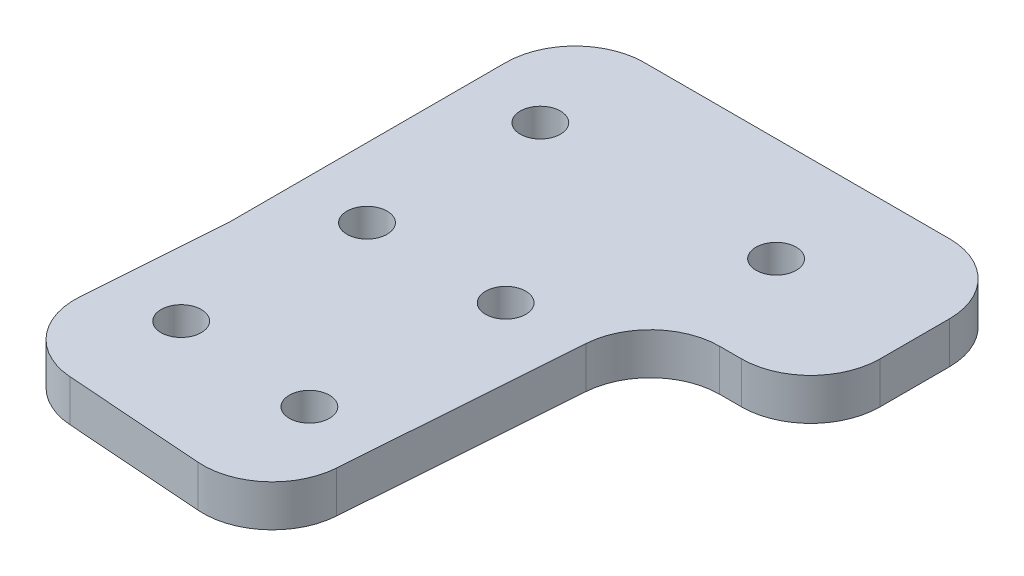
ISO-10303-21;
HEADER;
FILE_DESCRIPTION(('STEP AP214'),'2;1');
FILE_NAME('part.step','',(''),(''),'','','');
FILE_SCHEMA(('AUTOMOTIVE_DESIGN { 1 0 10303 214 1 1 1 1 }'));
ENDSEC;
DATA;
#1=APPLICATION_CONTEXT('core data for automotive mechanical design processes');
#2=APPLICATION_PROTOCOL_DEFINITION('international standard','automotive_design',2000,#1);
#3=PRODUCT_CONTEXT('',#1,'mechanical');
#4=PRODUCT('Part','Part','',(#3));
#5=PRODUCT_RELATED_PRODUCT_CATEGORY('part','',(#4));
#6=PRODUCT_DEFINITION_FORMATION('','',#4);
#7=PRODUCT_DEFINITION_CONTEXT('part definition',#1,'design');
#8=PRODUCT_DEFINITION('design','',#6,#7);
#9=PRODUCT_DEFINITION_SHAPE('','',#8);
#10=(LENGTH_UNIT() NAMED_UNIT(*) SI_UNIT(.MILLI.,.METRE.));
#11=(NAMED_UNIT(*) PLANE_ANGLE_UNIT() SI_UNIT($,.RADIAN.));
#12=(NAMED_UNIT(*) SI_UNIT($,.STERADIAN.) SOLID_ANGLE_UNIT());
#13=UNCERTAINTY_MEASURE_WITH_UNIT(LENGTH_MEASURE(1.E-05),#10,'distance_accuracy_value','');
#14=(GEOMETRIC_REPRESENTATION_CONTEXT(3) GLOBAL_UNCERTAINTY_ASSIGNED_CONTEXT((#13)) GLOBAL_UNIT_ASSIGNED_CONTEXT((#10,
#11,#12)) REPRESENTATION_CONTEXT('',''));
#15=CARTESIAN_POINT('',(0.,0.,0.));
#16=DIRECTION('',(0.,0.,1.));
#17=DIRECTION('',(1.,0.,0.));
#18=AXIS2_PLACEMENT_3D('',#15,#16,#17);
#19=CARTESIAN_POINT('',(0.,3.,0.));
#20=DIRECTION('',(0.,-1.,0.));
#21=DIRECTION('',(0.,0.,-1.));
#22=AXIS2_PLACEMENT_3D('',#19,#20,#21);
#23=PLANE('',#22);
#24=DIRECTION('',(0.,0.,-1.));
#25=VECTOR('',#24,1.);
#26=CARTESIAN_POINT('',(32.,3.,-15.));
#27=LINE('',#26,#25);
#28=CARTESIAN_POINT('',(32.,3.,-5.));
#29=VERTEX_POINT('',#28);
#30=CARTESIAN_POINT('',(32.,3.,-10.));
#31=VERTEX_POINT('',#30);
#32=EDGE_CURVE('E259',#29,#31,#27,.T.);
#33=ORIENTED_EDGE('',*,*,#32,.T.);
#34=CARTESIAN_POINT('',(27.,3.,-10.));
#35=DIRECTION('',(0.,-1.,0.));
#36=DIRECTION('',(0.,0.,-1.));
#37=AXIS2_PLACEMENT_3D('',#34,#35,#36);
#38=CIRCLE('',#37,5.);
#39=CARTESIAN_POINT('',(27.,3.,-15.));
#40=VERTEX_POINT('',#39);
#41=EDGE_CURVE('E198',#31,#40,#38,.F.);
#42=ORIENTED_EDGE('',*,*,#41,.T.);
#43=DIRECTION('',(-1.,0.,0.));
#44=VECTOR('',#43,1.);
#45=CARTESIAN_POINT('',(20.7810293969132,3.,-15.));
#46=LINE('',#45,#44);
#47=CARTESIAN_POINT('',(5.,3.,-15.));
#48=VERTEX_POINT('',#47);
#49=EDGE_CURVE('E163',#40,#48,#46,.T.);
#50=ORIENTED_EDGE('',*,*,#49,.T.);
#51=CARTESIAN_POINT('',(5.,3.,-10.));
#52=DIRECTION('',(0.,-1.,0.));
#53=DIRECTION('',(0.,0.,-1.));
#54=AXIS2_PLACEMENT_3D('',#51,#52,#53);
#55=CIRCLE('',#54,5.);
#56=CARTESIAN_POINT('',(0.,3.,-10.));
#57=VERTEX_POINT('',#56);
#58=EDGE_CURVE('E194',#48,#57,#55,.F.);
#59=ORIENTED_EDGE('',*,*,#58,.T.);
#60=DIRECTION('',(0.,0.,1.));
#61=VECTOR('',#60,1.);
#62=CARTESIAN_POINT('',(0.,3.,0.));
#63=LINE('',#62,#61);
#64=CARTESIAN_POINT('',(0.,3.,9.81821853800079));
#65=VERTEX_POINT('',#64);
#66=EDGE_CURVE('E171',#57,#65,#63,.T.);
#67=ORIENTED_EDGE('',*,*,#66,.T.);
#68=CARTESIAN_POINT('',(-5.,3.,9.81821853800079));
#69=DIRECTION('',(0.,-1.,0.));
#70=DIRECTION('',(0.,0.,-1.));
#71=AXIS2_PLACEMENT_3D('',#68,#69,#70);
#72=CIRCLE('',#71,5.);
#73=CARTESIAN_POINT('',(-0.0132003520093877,3.,10.1813015461418));
#74=VERTEX_POINT('',#73);
#75=EDGE_CURVE('E11',#65,#74,#72,.T.);
#76=ORIENTED_EDGE('',*,*,#75,.T.);
#77=DIRECTION('',(-0.0726166016281965,0.,0.997359929598122));
#78=VECTOR('',#77,1.);
#79=CARTESIAN_POINT('',(-1.089249024423,3.,24.9603989439725));
#80=LINE('',#79,#78);
#81=CARTESIAN_POINT('',(-0.726166016282043,3.,19.9735992959823));
#82=VERTEX_POINT('',#81);
#83=EDGE_CURVE('E175',#74,#82,#80,.T.);
#84=ORIENTED_EDGE('',*,*,#83,.T.);
#85=CARTESIAN_POINT('',(4.26063363170857,3.,20.3366823041233));
#86=DIRECTION('',(0.,-1.,0.));
#87=DIRECTION('',(0.,0.,-1.));
#88=AXIS2_PLACEMENT_3D('',#85,#86,#87);
#89=CIRCLE('',#88,5.);
#90=CARTESIAN_POINT('',(3.89755062356721,3.,25.3234819521139));
#91=VERTEX_POINT('',#90);
#92=EDGE_CURVE('E190',#82,#91,#89,.F.);
#93=ORIENTED_EDGE('',*,*,#92,.T.);
#94=DIRECTION('',(0.997359929598117,0.,0.0726166016282721));
#95=VECTOR('',#94,1.);
#96=CARTESIAN_POINT('',(18.8579495675394,3.,26.412730976538));
#97=LINE('',#96,#95);
#98=CARTESIAN_POINT('',(13.8711499195484,3.,26.0496479683966));
#99=VERTEX_POINT('',#98);
#100=EDGE_CURVE('E249',#91,#99,#97,.T.);
#101=ORIENTED_EDGE('',*,*,#100,.T.);
#102=CARTESIAN_POINT('',(14.2342329276898,3.,21.062848320406));
#103=DIRECTION('',(0.,-1.,0.));
#104=DIRECTION('',(0.,0.,-1.));
#105=AXIS2_PLACEMENT_3D('',#102,#103,#104);
#106=CIRCLE('',#105,5.);
#107=CARTESIAN_POINT('',(19.2210325756804,3.,21.425931328547));
#108=VERTEX_POINT('',#107);
#109=EDGE_CURVE('E192',#99,#108,#106,.F.);
#110=ORIENTED_EDGE('',*,*,#109,.T.);
#111=DIRECTION('',(0.0726166016281945,0.,-0.997359929598123));
#112=VECTOR('',#111,1.);
#113=CARTESIAN_POINT('',(19.9471985919625,3.,11.4523320325638));
#114=LINE('',#113,#112);
#115=CARTESIAN_POINT('',(20.443420932819,3.,4.63691699185902));
#116=VERTEX_POINT('',#115);
#117=EDGE_CURVE('E252',#108,#116,#114,.T.);
#118=ORIENTED_EDGE('',*,*,#117,.T.);
#119=CARTESIAN_POINT('',(25.4302205808096,3.,5.));
#120=DIRECTION('',(0.,-1.,0.));
#121=DIRECTION('',(0.,0.,-1.));
#122=AXIS2_PLACEMENT_3D('',#119,#120,#121);
#123=CIRCLE('',#122,5.);
#124=CARTESIAN_POINT('',(25.4302205808096,3.,0.));
#125=VERTEX_POINT('',#124);
#126=EDGE_CURVE('E63',#116,#125,#123,.T.);
#127=ORIENTED_EDGE('',*,*,#126,.T.);
#128=DIRECTION('',(1.,0.,0.));
#129=VECTOR('',#128,1.);
#130=CARTESIAN_POINT('',(32.,3.,0.));
#131=LINE('',#130,#129);
#132=CARTESIAN_POINT('',(27.,3.,0.));
#133=VERTEX_POINT('',#132);
#134=EDGE_CURVE('E257',#125,#133,#131,.T.);
#135=ORIENTED_EDGE('',*,*,#134,.T.);
#136=CARTESIAN_POINT('',(27.,3.,-5.));
#137=DIRECTION('',(0.,-1.,0.));
#138=DIRECTION('',(0.,0.,-1.));
#139=AXIS2_PLACEMENT_3D('',#136,#137,#138);
#140=CIRCLE('',#139,5.);
#141=EDGE_CURVE('E196',#133,#29,#140,.F.);
#142=ORIENTED_EDGE('',*,*,#141,.T.);
#143=EDGE_LOOP('',(#33,#42,#50,#59,#67,#76,#84,#93,#101,#110,#118,#127,#135,#142));
#144=FACE_BOUND('',#143,.T.);
#145=CARTESIAN_POINT('',(5.,3.,-7.5));
#146=DIRECTION('',(0.,1.,0.));
#147=DIRECTION('',(0.,0.,1.));
#148=AXIS2_PLACEMENT_3D('',#145,#146,#147);
#149=CIRCLE('',#148,1.45);
#150=CARTESIAN_POINT('',(5.,3.,-6.05));
#151=VERTEX_POINT('',#150);
#152=EDGE_CURVE('E238',#151,#151,#149,.T.);
#153=ORIENTED_EDGE('',*,*,#152,.F.);
#154=EDGE_LOOP('',(#153));
#155=FACE_BOUND('',#154,.T.);
#156=CARTESIAN_POINT('',(22.,3.,-7.5));
#157=DIRECTION('',(0.,1.,0.));
#158=DIRECTION('',(0.,0.,1.));
#159=AXIS2_PLACEMENT_3D('',#156,#157,#158);
#160=CIRCLE('',#159,1.45);
#161=CARTESIAN_POINT('',(22.,3.,-6.05));
#162=VERTEX_POINT('',#161);
#163=EDGE_CURVE('E352',#162,#162,#160,.T.);
#164=ORIENTED_EDGE('',*,*,#163,.F.);
#165=EDGE_LOOP('',(#164));
#166=FACE_BOUND('',#165,.T.);
#167=CARTESIAN_POINT('',(4.44217513577913,3.,17.8432824801269));
#168=DIRECTION('',(0.,1.,0.));
#169=DIRECTION('',(0.,0.,1.));
#170=AXIS2_PLACEMENT_3D('',#167,#168,#169);
#171=CIRCLE('',#170,1.45000000000004);
#172=CARTESIAN_POINT('',(4.44217513577913,3.,19.2932824801269));
#173=VERTEX_POINT('',#172);
#174=EDGE_CURVE('E346',#173,#173,#171,.T.);
#175=ORIENTED_EDGE('',*,*,#174,.F.);
#176=EDGE_LOOP('',(#175));
#177=FACE_BOUND('',#176,.T.);
#178=CARTESIAN_POINT('',(14.4157744317604,3.,18.5694484964088));
#179=DIRECTION('',(0.,1.,0.));
#180=DIRECTION('',(0.,0.,1.));
#181=AXIS2_PLACEMENT_3D('',#178,#179,#180);
#182=CIRCLE('',#181,1.45000000000003);
#183=CARTESIAN_POINT('',(14.4157744317604,3.,20.0194484964089));
#184=VERTEX_POINT('',#183);
#185=EDGE_CURVE('E340',#184,#184,#182,.T.);
#186=ORIENTED_EDGE('',*,*,#185,.F.);
#187=EDGE_LOOP('',(#186));
#188=FACE_BOUND('',#187,.T.);
#189=CARTESIAN_POINT('',(5.,3.,5.));
#190=DIRECTION('',(0.,1.,0.));
#191=DIRECTION('',(0.,0.,1.));
#192=AXIS2_PLACEMENT_3D('',#189,#190,#191);
#193=CIRCLE('',#192,1.45);
#194=CARTESIAN_POINT('',(5.,3.,6.45));
#195=VERTEX_POINT('',#194);
#196=EDGE_CURVE('E334',#195,#195,#193,.T.);
#197=ORIENTED_EDGE('',*,*,#196,.F.);
#198=EDGE_LOOP('',(#197));
#199=FACE_BOUND('',#198,.T.);
#200=CARTESIAN_POINT('',(15.,3.,5.));
#201=DIRECTION('',(0.,1.,0.));
#202=DIRECTION('',(0.,0.,1.));
#203=AXIS2_PLACEMENT_3D('',#200,#201,#202);
#204=CIRCLE('',#203,1.45);
#205=CARTESIAN_POINT('',(15.,3.,6.45));
#206=VERTEX_POINT('',#205);
#207=EDGE_CURVE('E325',#206,#206,#204,.T.);
#208=ORIENTED_EDGE('',*,*,#207,.F.);
#209=EDGE_LOOP('',(#208));
#210=FACE_BOUND('',#209,.T.);
#211=ADVANCED_FACE('F41',(#144,#155,#166,#177,#188,#199,#210),#23,.F.);
#212=CARTESIAN_POINT('',(0.,0.,0.));
#213=DIRECTION('',(0.,-1.,0.));
#214=DIRECTION('',(0.,0.,-1.));
#215=AXIS2_PLACEMENT_3D('',#212,#213,#214);
#216=PLANE('',#215);
#217=CARTESIAN_POINT('',(5.,0.,5.));
#218=DIRECTION('',(0.,1.,0.));
#219=DIRECTION('',(0.,0.,1.));
#220=AXIS2_PLACEMENT_3D('',#217,#218,#219);
#221=CIRCLE('',#220,1.45);
#222=CARTESIAN_POINT('',(5.,0.,6.45));
#223=VERTEX_POINT('',#222);
#224=EDGE_CURVE('E331',#223,#223,#221,.T.);
#225=ORIENTED_EDGE('',*,*,#224,.T.);
#226=EDGE_LOOP('',(#225));
#227=FACE_BOUND('',#226,.T.);
#228=CARTESIAN_POINT('',(4.44217513577913,0.,17.8432824801269));
#229=DIRECTION('',(0.,1.,0.));
#230=DIRECTION('',(0.,0.,1.));
#231=AXIS2_PLACEMENT_3D('',#228,#229,#230);
#232=CIRCLE('',#231,1.45000000000004);
#233=CARTESIAN_POINT('',(4.44217513577913,0.,19.2932824801269));
#234=VERTEX_POINT('',#233);
#235=EDGE_CURVE('E343',#234,#234,#232,.T.);
#236=ORIENTED_EDGE('',*,*,#235,.T.);
#237=EDGE_LOOP('',(#236));
#238=FACE_BOUND('',#237,.T.);
#239=CARTESIAN_POINT('',(5.,0.,-7.5));
#240=DIRECTION('',(0.,1.,0.));
#241=DIRECTION('',(0.,0.,1.));
#242=AXIS2_PLACEMENT_3D('',#239,#240,#241);
#243=CIRCLE('',#242,1.45);
#244=CARTESIAN_POINT('',(5.,0.,-6.05));
#245=VERTEX_POINT('',#244);
#246=EDGE_CURVE('E355',#245,#245,#243,.T.);
#247=ORIENTED_EDGE('',*,*,#246,.T.);
#248=EDGE_LOOP('',(#247));
#249=FACE_BOUND('',#248,.T.);
#250=DIRECTION('',(-1.,0.,0.));
#251=VECTOR('',#250,1.);
#252=CARTESIAN_POINT('',(0.,0.,-15.));
#253=LINE('',#252,#251);
#254=CARTESIAN_POINT('',(27.,0.,-15.));
#255=VERTEX_POINT('',#254);
#256=CARTESIAN_POINT('',(5.,0.,-15.));
#257=VERTEX_POINT('',#256);
#258=EDGE_CURVE('E160',#255,#257,#253,.T.);
#259=ORIENTED_EDGE('',*,*,#258,.F.);
#260=CARTESIAN_POINT('',(27.,0.,-10.));
#261=DIRECTION('',(0.,-1.,0.));
#262=DIRECTION('',(0.,0.,-1.));
#263=AXIS2_PLACEMENT_3D('',#260,#261,#262);
#264=CIRCLE('',#263,5.);
#265=CARTESIAN_POINT('',(32.,0.,-10.));
#266=VERTEX_POINT('',#265);
#267=EDGE_CURVE('E143',#255,#266,#264,.T.);
#268=ORIENTED_EDGE('',*,*,#267,.T.);
#269=DIRECTION('',(0.,0.,-1.));
#270=VECTOR('',#269,1.);
#271=CARTESIAN_POINT('',(32.,0.,-15.));
#272=LINE('',#271,#270);
#273=CARTESIAN_POINT('',(32.,0.,-5.));
#274=VERTEX_POINT('',#273);
#275=EDGE_CURVE('E172',#274,#266,#272,.T.);
#276=ORIENTED_EDGE('',*,*,#275,.F.);
#277=CARTESIAN_POINT('',(27.,0.,-5.));
#278=DIRECTION('',(0.,-1.,0.));
#279=DIRECTION('',(0.,0.,-1.));
#280=AXIS2_PLACEMENT_3D('',#277,#278,#279);
#281=CIRCLE('',#280,5.);
#282=CARTESIAN_POINT('',(27.,0.,0.));
#283=VERTEX_POINT('',#282);
#284=EDGE_CURVE('E154',#274,#283,#281,.T.);
#285=ORIENTED_EDGE('',*,*,#284,.T.);
#286=DIRECTION('',(1.,0.,0.));
#287=VECTOR('',#286,1.);
#288=CARTESIAN_POINT('',(32.,0.,0.));
#289=LINE('',#288,#287);
#290=CARTESIAN_POINT('',(25.4302205808096,0.,0.));
#291=VERTEX_POINT('',#290);
#292=EDGE_CURVE('E177',#291,#283,#289,.T.);
#293=ORIENTED_EDGE('',*,*,#292,.F.);
#294=CARTESIAN_POINT('',(25.4302205808096,0.,5.));
#295=DIRECTION('',(0.,-1.,0.));
#296=DIRECTION('',(0.,0.,-1.));
#297=AXIS2_PLACEMENT_3D('',#294,#295,#296);
#298=CIRCLE('',#297,5.);
#299=CARTESIAN_POINT('',(20.443420932819,0.,4.63691699185902));
#300=VERTEX_POINT('',#299);
#301=EDGE_CURVE('E224',#291,#300,#298,.F.);
#302=ORIENTED_EDGE('',*,*,#301,.T.);
#303=DIRECTION('',(0.0726166016281951,0.,-0.997359929598123));
#304=VECTOR('',#303,1.);
#305=CARTESIAN_POINT('',(19.9471985919625,0.,11.4523320325638));
#306=LINE('',#305,#304);
#307=CARTESIAN_POINT('',(19.2210325756804,0.,21.425931328547));
#308=VERTEX_POINT('',#307);
#309=EDGE_CURVE('E266',#308,#300,#306,.T.);
#310=ORIENTED_EDGE('',*,*,#309,.F.);
#311=CARTESIAN_POINT('',(14.2342329276898,0.,21.062848320406));
#312=DIRECTION('',(0.,-1.,0.));
#313=DIRECTION('',(0.,0.,-1.));
#314=AXIS2_PLACEMENT_3D('',#311,#312,#313);
#315=CIRCLE('',#314,5.);
#316=CARTESIAN_POINT('',(13.8711499195484,0.,26.0496479683966));
#317=VERTEX_POINT('',#316);
#318=EDGE_CURVE('E183',#308,#317,#315,.T.);
#319=ORIENTED_EDGE('',*,*,#318,.T.);
#320=DIRECTION('',(0.997359929598117,0.,0.0726166016282721));
#321=VECTOR('',#320,1.);
#322=CARTESIAN_POINT('',(18.8579495675394,0.,26.412730976538));
#323=LINE('',#322,#321);
#324=CARTESIAN_POINT('',(3.89755062356721,0.,25.3234819521139));
#325=VERTEX_POINT('',#324);
#326=EDGE_CURVE('E263',#325,#317,#323,.T.);
#327=ORIENTED_EDGE('',*,*,#326,.F.);
#328=CARTESIAN_POINT('',(4.26063363170857,0.,20.3366823041233));
#329=DIRECTION('',(0.,-1.,0.));
#330=DIRECTION('',(0.,0.,-1.));
#331=AXIS2_PLACEMENT_3D('',#328,#329,#330);
#332=CIRCLE('',#331,5.);
#333=CARTESIAN_POINT('',(-0.726166016282043,0.,19.9735992959823));
#334=VERTEX_POINT('',#333);
#335=EDGE_CURVE('E164',#325,#334,#332,.T.);
#336=ORIENTED_EDGE('',*,*,#335,.T.);
#337=DIRECTION('',(-0.0726166016281965,0.,0.997359929598122));
#338=VECTOR('',#337,1.);
#339=CARTESIAN_POINT('',(-1.089249024423,0.,24.9603989439725));
#340=LINE('',#339,#338);
#341=CARTESIAN_POINT('',(-0.0132003520093877,0.,10.1813015461418));
#342=VERTEX_POINT('',#341);
#343=EDGE_CURVE('E230',#342,#334,#340,.T.);
#344=ORIENTED_EDGE('',*,*,#343,.F.);
#345=CARTESIAN_POINT('',(-5.,0.,9.81821853800079));
#346=DIRECTION('',(0.,-1.,0.));
#347=DIRECTION('',(0.,0.,-1.));
#348=AXIS2_PLACEMENT_3D('',#345,#346,#347);
#349=CIRCLE('',#348,5.);
#350=CARTESIAN_POINT('',(0.,0.,9.81821853800079));
#351=VERTEX_POINT('',#350);
#352=EDGE_CURVE('E49',#342,#351,#349,.F.);
#353=ORIENTED_EDGE('',*,*,#352,.T.);
#354=DIRECTION('',(0.,0.,1.));
#355=VECTOR('',#354,1.);
#356=CARTESIAN_POINT('',(0.,0.,0.));
#357=LINE('',#356,#355);
#358=CARTESIAN_POINT('',(0.,0.,-10.));
#359=VERTEX_POINT('',#358);
#360=EDGE_CURVE('E228',#359,#351,#357,.T.);
#361=ORIENTED_EDGE('',*,*,#360,.F.);
#362=CARTESIAN_POINT('',(5.,0.,-10.));
#363=DIRECTION('',(0.,-1.,0.));
#364=DIRECTION('',(0.,0.,-1.));
#365=AXIS2_PLACEMENT_3D('',#362,#363,#364);
#366=CIRCLE('',#365,5.);
#367=EDGE_CURVE('E170',#359,#257,#366,.T.);
#368=ORIENTED_EDGE('',*,*,#367,.T.);
#369=EDGE_LOOP('',(#259,#268,#276,#285,#293,#302,#310,#319,#327,#336,#344,#353,#361,#368));
#370=FACE_BOUND('',#369,.T.);
#371=CARTESIAN_POINT('',(22.,0.,-7.5));
#372=DIRECTION('',(0.,1.,0.));
#373=DIRECTION('',(0.,0.,1.));
#374=AXIS2_PLACEMENT_3D('',#371,#372,#373);
#375=CIRCLE('',#374,1.45);
#376=CARTESIAN_POINT('',(22.,0.,-6.05));
#377=VERTEX_POINT('',#376);
#378=EDGE_CURVE('E349',#377,#377,#375,.T.);
#379=ORIENTED_EDGE('',*,*,#378,.T.);
#380=EDGE_LOOP('',(#379));
#381=FACE_BOUND('',#380,.T.);
#382=CARTESIAN_POINT('',(14.4157744317604,0.,18.5694484964088));
#383=DIRECTION('',(0.,1.,0.));
#384=DIRECTION('',(0.,0.,1.));
#385=AXIS2_PLACEMENT_3D('',#382,#383,#384);
#386=CIRCLE('',#385,1.45000000000003);
#387=CARTESIAN_POINT('',(14.4157744317604,0.,20.0194484964089));
#388=VERTEX_POINT('',#387);
#389=EDGE_CURVE('E337',#388,#388,#386,.T.);
#390=ORIENTED_EDGE('',*,*,#389,.T.);
#391=EDGE_LOOP('',(#390));
#392=FACE_BOUND('',#391,.T.);
#393=CARTESIAN_POINT('',(15.,0.,5.));
#394=DIRECTION('',(0.,1.,0.));
#395=DIRECTION('',(0.,0.,1.));
#396=AXIS2_PLACEMENT_3D('',#393,#394,#395);
#397=CIRCLE('',#396,1.45);
#398=CARTESIAN_POINT('',(15.,0.,6.45));
#399=VERTEX_POINT('',#398);
#400=EDGE_CURVE('E328',#399,#399,#397,.T.);
#401=ORIENTED_EDGE('',*,*,#400,.T.);
#402=EDGE_LOOP('',(#401));
#403=FACE_BOUND('',#402,.T.);
#404=ADVANCED_FACE('F167',(#227,#238,#249,#370,#381,#392,#403),#216,.T.);
#405=CARTESIAN_POINT('',(0.,3.,0.));
#406=DIRECTION('',(1.,0.,0.));
#407=DIRECTION('',(0.,0.,-1.));
#408=AXIS2_PLACEMENT_3D('',#405,#406,#407);
#409=PLANE('',#408);
#410=ORIENTED_EDGE('',*,*,#66,.F.);
#411=DIRECTION('',(0.,-1.,0.));
#412=VECTOR('',#411,1.);
#413=CARTESIAN_POINT('',(0.,3.,-10.));
#414=LINE('',#413,#412);
#415=EDGE_CURVE('E211',#57,#359,#414,.T.);
#416=ORIENTED_EDGE('',*,*,#415,.T.);
#417=ORIENTED_EDGE('',*,*,#360,.T.);
#418=DIRECTION('',(0.,-1.,0.));
#419=VECTOR('',#418,1.);
#420=CARTESIAN_POINT('',(0.,3.,9.81821853800079));
#421=LINE('',#420,#419);
#422=EDGE_CURVE('E209',#351,#65,#421,.F.);
#423=ORIENTED_EDGE('',*,*,#422,.T.);
#424=EDGE_LOOP('',(#410,#416,#417,#423));
#425=FACE_BOUND('',#424,.T.);
#426=ADVANCED_FACE('F236',(#425),#409,.F.);
#427=CARTESIAN_POINT('',(-1.089249024423,3.,24.9603989439725));
#428=DIRECTION('',(0.997359929598122,0.,0.0726166016281965));
#429=DIRECTION('',(0.0726166016281965,0.,-0.997359929598122));
#430=AXIS2_PLACEMENT_3D('',#427,#428,#429);
#431=PLANE('',#430);
#432=ORIENTED_EDGE('',*,*,#343,.T.);
#433=DIRECTION('',(0.,-1.,0.));
#434=VECTOR('',#433,1.);
#435=CARTESIAN_POINT('',(-0.726166016282043,3.,19.9735992959823));
#436=LINE('',#435,#434);
#437=EDGE_CURVE('E222',#334,#82,#436,.F.);
#438=ORIENTED_EDGE('',*,*,#437,.T.);
#439=ORIENTED_EDGE('',*,*,#83,.F.);
#440=DIRECTION('',(0.,-1.,0.));
#441=VECTOR('',#440,1.);
#442=CARTESIAN_POINT('',(-0.0132003520093877,0.,10.1813015461418));
#443=LINE('',#442,#441);
#444=EDGE_CURVE('E219',#74,#342,#443,.T.);
#445=ORIENTED_EDGE('',*,*,#444,.T.);
#446=EDGE_LOOP('',(#432,#438,#439,#445));
#447=FACE_BOUND('',#446,.T.);
#448=ADVANCED_FACE('F247',(#447),#431,.F.);
#449=CARTESIAN_POINT('',(18.8579495675394,3.,26.412730976538));
#450=DIRECTION('',(0.0726166016282721,0.,-0.997359929598117));
#451=DIRECTION('',(-0.997359929598117,0.,-0.0726166016282721));
#452=AXIS2_PLACEMENT_3D('',#449,#450,#451);
#453=PLANE('',#452);
#454=ORIENTED_EDGE('',*,*,#326,.T.);
#455=DIRECTION('',(0.,-1.,0.));
#456=VECTOR('',#455,1.);
#457=CARTESIAN_POINT('',(13.8711499195484,3.,26.0496479683966));
#458=LINE('',#457,#456);
#459=EDGE_CURVE('E217',#317,#99,#458,.F.);
#460=ORIENTED_EDGE('',*,*,#459,.T.);
#461=ORIENTED_EDGE('',*,*,#100,.F.);
#462=DIRECTION('',(0.,-1.,0.));
#463=VECTOR('',#462,1.);
#464=CARTESIAN_POINT('',(3.89755062356721,3.,25.3234819521139));
#465=LINE('',#464,#463);
#466=EDGE_CURVE('E214',#91,#325,#465,.T.);
#467=ORIENTED_EDGE('',*,*,#466,.T.);
#468=EDGE_LOOP('',(#454,#460,#461,#467));
#469=FACE_BOUND('',#468,.T.);
#470=ADVANCED_FACE('F411',(#469),#453,.F.);
#471=CARTESIAN_POINT('',(19.9471985919625,3.,11.4523320325638));
#472=DIRECTION('',(-0.997359929598123,0.,-0.0726166016281951));
#473=DIRECTION('',(-0.0726166016281951,0.,0.997359929598123));
#474=AXIS2_PLACEMENT_3D('',#471,#472,#473);
#475=PLANE('',#474);
#476=ORIENTED_EDGE('',*,*,#309,.T.);
#477=DIRECTION('',(0.,-1.,0.));
#478=VECTOR('',#477,1.);
#479=CARTESIAN_POINT('',(20.443420932819,3.,4.63691699185903));
#480=LINE('',#479,#478);
#481=EDGE_CURVE('E207',#300,#116,#480,.F.);
#482=ORIENTED_EDGE('',*,*,#481,.T.);
#483=ORIENTED_EDGE('',*,*,#117,.F.);
#484=DIRECTION('',(0.,-1.,0.));
#485=VECTOR('',#484,1.);
#486=CARTESIAN_POINT('',(19.2210325756804,3.,21.425931328547));
#487=LINE('',#486,#485);
#488=EDGE_CURVE('E204',#108,#308,#487,.T.);
#489=ORIENTED_EDGE('',*,*,#488,.T.);
#490=EDGE_LOOP('',(#476,#482,#483,#489));
#491=FACE_BOUND('',#490,.T.);
#492=ADVANCED_FACE('F286',(#491),#475,.F.);
#493=CARTESIAN_POINT('',(32.,3.,0.));
#494=DIRECTION('',(0.,0.,-1.));
#495=DIRECTION('',(-1.,0.,0.));
#496=AXIS2_PLACEMENT_3D('',#493,#494,#495);
#497=PLANE('',#496);
#498=ORIENTED_EDGE('',*,*,#292,.T.);
#499=DIRECTION('',(0.,-1.,0.));
#500=VECTOR('',#499,1.);
#501=CARTESIAN_POINT('',(27.,3.,0.));
#502=LINE('',#501,#500);
#503=EDGE_CURVE('E56',#283,#133,#502,.F.);
#504=ORIENTED_EDGE('',*,*,#503,.T.);
#505=ORIENTED_EDGE('',*,*,#134,.F.);
#506=DIRECTION('',(0.,-1.,0.));
#507=VECTOR('',#506,1.);
#508=CARTESIAN_POINT('',(25.4302205808096,0.,0.));
#509=LINE('',#508,#507);
#510=EDGE_CURVE('E200',#125,#291,#509,.T.);
#511=ORIENTED_EDGE('',*,*,#510,.T.);
#512=EDGE_LOOP('',(#498,#504,#505,#511));
#513=FACE_BOUND('',#512,.T.);
#514=ADVANCED_FACE('F269',(#513),#497,.F.);
#515=CARTESIAN_POINT('',(32.,3.,-15.));
#516=DIRECTION('',(-1.,0.,0.));
#517=DIRECTION('',(0.,0.,1.));
#518=AXIS2_PLACEMENT_3D('',#515,#516,#517);
#519=PLANE('',#518);
#520=ORIENTED_EDGE('',*,*,#275,.T.);
#521=DIRECTION('',(0.,-1.,0.));
#522=VECTOR('',#521,1.);
#523=CARTESIAN_POINT('',(32.,3.,-10.));
#524=LINE('',#523,#522);
#525=EDGE_CURVE('E148',#266,#31,#524,.F.);
#526=ORIENTED_EDGE('',*,*,#525,.T.);
#527=ORIENTED_EDGE('',*,*,#32,.F.);
#528=DIRECTION('',(0.,-1.,0.));
#529=VECTOR('',#528,1.);
#530=CARTESIAN_POINT('',(32.,3.,-5.));
#531=LINE('',#530,#529);
#532=EDGE_CURVE('E153',#29,#274,#531,.T.);
#533=ORIENTED_EDGE('',*,*,#532,.T.);
#534=EDGE_LOOP('',(#520,#526,#527,#533));
#535=FACE_BOUND('',#534,.T.);
#536=ADVANCED_FACE('F277',(#535),#519,.F.);
#537=CARTESIAN_POINT('',(0.,3.,-15.));
#538=DIRECTION('',(0.,0.,1.));
#539=DIRECTION('',(1.,0.,0.));
#540=AXIS2_PLACEMENT_3D('',#537,#538,#539);
#541=PLANE('',#540);
#542=ORIENTED_EDGE('',*,*,#49,.F.);
#543=DIRECTION('',(0.,-1.,0.));
#544=VECTOR('',#543,1.);
#545=CARTESIAN_POINT('',(27.,3.,-15.));
#546=LINE('',#545,#544);
#547=EDGE_CURVE('E147',#40,#255,#546,.T.);
#548=ORIENTED_EDGE('',*,*,#547,.T.);
#549=ORIENTED_EDGE('',*,*,#258,.T.);
#550=DIRECTION('',(0.,-1.,0.));
#551=VECTOR('',#550,1.);
#552=CARTESIAN_POINT('',(5.,3.,-15.));
#553=LINE('',#552,#551);
#554=EDGE_CURVE('E165',#257,#48,#553,.F.);
#555=ORIENTED_EDGE('',*,*,#554,.T.);
#556=EDGE_LOOP('',(#542,#548,#549,#555));
#557=FACE_BOUND('',#556,.T.);
#558=ADVANCED_FACE('F159',(#557),#541,.F.);
#559=CARTESIAN_POINT('',(5.,3.,-7.5));
#560=DIRECTION('',(0.,-1.,0.));
#561=DIRECTION('',(0.,0.,-1.));
#562=AXIS2_PLACEMENT_3D('',#559,#560,#561);
#563=CYLINDRICAL_SURFACE('',#562,1.45);
#564=ORIENTED_EDGE('',*,*,#152,.T.);
#565=EDGE_LOOP('',(#564));
#566=FACE_BOUND('',#565,.T.);
#567=ORIENTED_EDGE('',*,*,#246,.F.);
#568=EDGE_LOOP('',(#567));
#569=FACE_BOUND('',#568,.T.);
#570=ADVANCED_FACE('F284',(#566,#569),#563,.F.);
#571=CARTESIAN_POINT('',(22.,3.,-7.5));
#572=DIRECTION('',(0.,-1.,0.));
#573=DIRECTION('',(0.,0.,-1.));
#574=AXIS2_PLACEMENT_3D('',#571,#572,#573);
#575=CYLINDRICAL_SURFACE('',#574,1.45);
#576=ORIENTED_EDGE('',*,*,#163,.T.);
#577=EDGE_LOOP('',(#576));
#578=FACE_BOUND('',#577,.T.);
#579=ORIENTED_EDGE('',*,*,#378,.F.);
#580=EDGE_LOOP('',(#579));
#581=FACE_BOUND('',#580,.T.);
#582=ADVANCED_FACE('F299',(#578,#581),#575,.F.);
#583=CARTESIAN_POINT('',(4.44217513577913,3.,17.8432824801269));
#584=DIRECTION('',(0.,-1.,0.));
#585=DIRECTION('',(0.,0.,-1.));
#586=AXIS2_PLACEMENT_3D('',#583,#584,#585);
#587=CYLINDRICAL_SURFACE('',#586,1.45000000000004);
#588=ORIENTED_EDGE('',*,*,#174,.T.);
#589=EDGE_LOOP('',(#588));
#590=FACE_BOUND('',#589,.T.);
#591=ORIENTED_EDGE('',*,*,#235,.F.);
#592=EDGE_LOOP('',(#591));
#593=FACE_BOUND('',#592,.T.);
#594=ADVANCED_FACE('F303',(#590,#593),#587,.F.);
#595=CARTESIAN_POINT('',(14.4157744317604,3.,18.5694484964088));
#596=DIRECTION('',(0.,-1.,0.));
#597=DIRECTION('',(0.,0.,-1.));
#598=AXIS2_PLACEMENT_3D('',#595,#596,#597);
#599=CYLINDRICAL_SURFACE('',#598,1.45000000000003);
#600=ORIENTED_EDGE('',*,*,#185,.T.);
#601=EDGE_LOOP('',(#600));
#602=FACE_BOUND('',#601,.T.);
#603=ORIENTED_EDGE('',*,*,#389,.F.);
#604=EDGE_LOOP('',(#603));
#605=FACE_BOUND('',#604,.T.);
#606=ADVANCED_FACE('F307',(#602,#605),#599,.F.);
#607=CARTESIAN_POINT('',(5.,3.,5.));
#608=DIRECTION('',(0.,-1.,0.));
#609=DIRECTION('',(0.,0.,-1.));
#610=AXIS2_PLACEMENT_3D('',#607,#608,#609);
#611=CYLINDRICAL_SURFACE('',#610,1.45);
#612=ORIENTED_EDGE('',*,*,#196,.T.);
#613=EDGE_LOOP('',(#612));
#614=FACE_BOUND('',#613,.T.);
#615=ORIENTED_EDGE('',*,*,#224,.F.);
#616=EDGE_LOOP('',(#615));
#617=FACE_BOUND('',#616,.T.);
#618=ADVANCED_FACE('F311',(#614,#617),#611,.F.);
#619=CARTESIAN_POINT('',(15.,3.,5.));
#620=DIRECTION('',(0.,-1.,0.));
#621=DIRECTION('',(0.,0.,-1.));
#622=AXIS2_PLACEMENT_3D('',#619,#620,#621);
#623=CYLINDRICAL_SURFACE('',#622,1.45);
#624=ORIENTED_EDGE('',*,*,#207,.T.);
#625=EDGE_LOOP('',(#624));
#626=FACE_BOUND('',#625,.T.);
#627=ORIENTED_EDGE('',*,*,#400,.F.);
#628=EDGE_LOOP('',(#627));
#629=FACE_BOUND('',#628,.T.);
#630=ADVANCED_FACE('F315',(#626,#629),#623,.F.);
#631=CARTESIAN_POINT('',(27.,3.,-10.));
#632=DIRECTION('',(0.,-1.,0.));
#633=DIRECTION('',(0.,0.,-1.));
#634=AXIS2_PLACEMENT_3D('',#631,#632,#633);
#635=CYLINDRICAL_SURFACE('',#634,5.);
#636=ORIENTED_EDGE('',*,*,#41,.F.);
#637=ORIENTED_EDGE('',*,*,#525,.F.);
#638=ORIENTED_EDGE('',*,*,#267,.F.);
#639=ORIENTED_EDGE('',*,*,#547,.F.);
#640=EDGE_LOOP('',(#636,#637,#638,#639));
#641=FACE_BOUND('',#640,.T.);
#642=ADVANCED_FACE('F146',(#641),#635,.T.);
#643=CARTESIAN_POINT('',(27.,3.,-5.));
#644=DIRECTION('',(0.,-1.,0.));
#645=DIRECTION('',(0.,0.,-1.));
#646=AXIS2_PLACEMENT_3D('',#643,#644,#645);
#647=CYLINDRICAL_SURFACE('',#646,5.);
#648=ORIENTED_EDGE('',*,*,#141,.F.);
#649=ORIENTED_EDGE('',*,*,#503,.F.);
#650=ORIENTED_EDGE('',*,*,#284,.F.);
#651=ORIENTED_EDGE('',*,*,#532,.F.);
#652=EDGE_LOOP('',(#648,#649,#650,#651));
#653=FACE_BOUND('',#652,.T.);
#654=ADVANCED_FACE('F273',(#653),#647,.T.);
#655=CARTESIAN_POINT('',(25.4302205808096,3.,5.));
#656=DIRECTION('',(0.,1.,0.));
#657=DIRECTION('',(0.,0.,1.));
#658=AXIS2_PLACEMENT_3D('',#655,#656,#657);
#659=CYLINDRICAL_SURFACE('',#658,5.);
#660=ORIENTED_EDGE('',*,*,#126,.F.);
#661=ORIENTED_EDGE('',*,*,#481,.F.);
#662=ORIENTED_EDGE('',*,*,#301,.F.);
#663=ORIENTED_EDGE('',*,*,#510,.F.);
#664=EDGE_LOOP('',(#660,#661,#662,#663));
#665=FACE_BOUND('',#664,.T.);
#666=ADVANCED_FACE('F386',(#665),#659,.F.);
#667=CARTESIAN_POINT('',(5.,3.,-10.));
#668=DIRECTION('',(0.,-1.,0.));
#669=DIRECTION('',(0.,0.,-1.));
#670=AXIS2_PLACEMENT_3D('',#667,#668,#669);
#671=CYLINDRICAL_SURFACE('',#670,5.);
#672=ORIENTED_EDGE('',*,*,#58,.F.);
#673=ORIENTED_EDGE('',*,*,#554,.F.);
#674=ORIENTED_EDGE('',*,*,#367,.F.);
#675=ORIENTED_EDGE('',*,*,#415,.F.);
#676=EDGE_LOOP('',(#672,#673,#674,#675));
#677=FACE_BOUND('',#676,.T.);
#678=ADVANCED_FACE('F393',(#677),#671,.T.);
#679=CARTESIAN_POINT('',(14.2342329276898,3.,21.062848320406));
#680=DIRECTION('',(0.,-1.,0.));
#681=DIRECTION('',(0.,0.,-1.));
#682=AXIS2_PLACEMENT_3D('',#679,#680,#681);
#683=CYLINDRICAL_SURFACE('',#682,5.);
#684=ORIENTED_EDGE('',*,*,#109,.F.);
#685=ORIENTED_EDGE('',*,*,#459,.F.);
#686=ORIENTED_EDGE('',*,*,#318,.F.);
#687=ORIENTED_EDGE('',*,*,#488,.F.);
#688=EDGE_LOOP('',(#684,#685,#686,#687));
#689=FACE_BOUND('',#688,.T.);
#690=ADVANCED_FACE('F397',(#689),#683,.T.);
#691=CARTESIAN_POINT('',(4.26063363170857,3.,20.3366823041233));
#692=DIRECTION('',(0.,-1.,0.));
#693=DIRECTION('',(0.,0.,-1.));
#694=AXIS2_PLACEMENT_3D('',#691,#692,#693);
#695=CYLINDRICAL_SURFACE('',#694,5.);
#696=ORIENTED_EDGE('',*,*,#92,.F.);
#697=ORIENTED_EDGE('',*,*,#437,.F.);
#698=ORIENTED_EDGE('',*,*,#335,.F.);
#699=ORIENTED_EDGE('',*,*,#466,.F.);
#700=EDGE_LOOP('',(#696,#697,#698,#699));
#701=FACE_BOUND('',#700,.T.);
#702=ADVANCED_FACE('F400',(#701),#695,.T.);
#703=CARTESIAN_POINT('',(-5.,3.,9.81821853800079));
#704=DIRECTION('',(0.,1.,0.));
#705=DIRECTION('',(0.,0.,1.));
#706=AXIS2_PLACEMENT_3D('',#703,#704,#705);
#707=CYLINDRICAL_SURFACE('',#706,5.);
#708=ORIENTED_EDGE('',*,*,#75,.F.);
#709=ORIENTED_EDGE('',*,*,#422,.F.);
#710=ORIENTED_EDGE('',*,*,#352,.F.);
#711=ORIENTED_EDGE('',*,*,#444,.F.);
#712=EDGE_LOOP('',(#708,#709,#710,#711));
#713=FACE_BOUND('',#712,.T.);
#714=ADVANCED_FACE('F43',(#713),#707,.F.);
#715=CLOSED_SHELL('',(#211,#404,#426,#448,#470,#492,#514,#536,#558,#570,#582,#594,#606,#618,
#630,#642,#654,#666,#678,#690,#702,#714));
#716=MANIFOLD_SOLID_BREP('B2',#715);
#717=ADVANCED_BREP_SHAPE_REPRESENTATION('',(#18,#716),#14);
#718=SHAPE_DEFINITION_REPRESENTATION(#9,#717);
ENDSEC;
END-ISO-10303-21;
